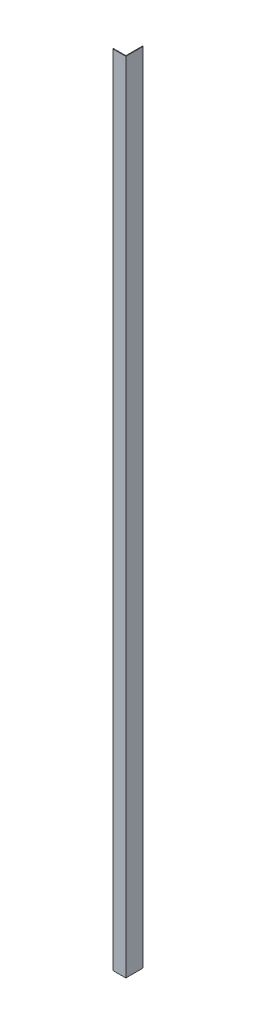
ISO-10303-21;
HEADER;
FILE_DESCRIPTION(('STEP AP214'),'2;1');
FILE_NAME('part.step','',(''),(''),'','','');
FILE_SCHEMA(('AUTOMOTIVE_DESIGN { 1 0 10303 214 1 1 1 1 }'));
ENDSEC;
DATA;
#1=APPLICATION_CONTEXT('core data for automotive mechanical design processes');
#2=APPLICATION_PROTOCOL_DEFINITION('international standard','automotive_design',2000,#1);
#3=PRODUCT_CONTEXT('',#1,'mechanical');
#4=PRODUCT('Part','Part','',(#3));
#5=PRODUCT_RELATED_PRODUCT_CATEGORY('part','',(#4));
#6=PRODUCT_DEFINITION_FORMATION('','',#4);
#7=PRODUCT_DEFINITION_CONTEXT('part definition',#1,'design');
#8=PRODUCT_DEFINITION('design','',#6,#7);
#9=PRODUCT_DEFINITION_SHAPE('','',#8);
#10=(LENGTH_UNIT() NAMED_UNIT(*) SI_UNIT(.MILLI.,.METRE.));
#11=(NAMED_UNIT(*) PLANE_ANGLE_UNIT() SI_UNIT($,.RADIAN.));
#12=(NAMED_UNIT(*) SI_UNIT($,.STERADIAN.) SOLID_ANGLE_UNIT());
#13=UNCERTAINTY_MEASURE_WITH_UNIT(LENGTH_MEASURE(1.E-05),#10,'distance_accuracy_value','');
#14=(GEOMETRIC_REPRESENTATION_CONTEXT(3) GLOBAL_UNCERTAINTY_ASSIGNED_CONTEXT((#13)) GLOBAL_UNIT_ASSIGNED_CONTEXT((#10,
#11,#12)) REPRESENTATION_CONTEXT('',''));
#15=CARTESIAN_POINT('',(0.,0.,0.));
#16=DIRECTION('',(0.,0.,1.));
#17=DIRECTION('',(1.,0.,0.));
#18=AXIS2_PLACEMENT_3D('',#15,#16,#17);
#19=CARTESIAN_POINT('',(30.,1970.,40.));
#20=DIRECTION('',(0.,0.,-1.));
#21=DIRECTION('',(-1.,0.,0.));
#22=AXIS2_PLACEMENT_3D('',#19,#20,#21);
#23=PLANE('',#22);
#24=DIRECTION('',(1.,0.,0.));
#25=VECTOR('',#24,1.);
#26=CARTESIAN_POINT('',(30.,120.,40.));
#27=LINE('',#26,#25);
#28=CARTESIAN_POINT('',(0.,120.,40.));
#29=VERTEX_POINT('',#28);
#30=CARTESIAN_POINT('',(30.,120.,40.));
#31=VERTEX_POINT('',#30);
#32=EDGE_CURVE('E123',#29,#31,#27,.T.);
#33=ORIENTED_EDGE('',*,*,#32,.T.);
#34=DIRECTION('',(0.,-1.,0.));
#35=VECTOR('',#34,1.);
#36=CARTESIAN_POINT('',(30.,1970.,40.));
#37=LINE('',#36,#35);
#38=CARTESIAN_POINT('',(30.,1970.,40.));
#39=VERTEX_POINT('',#38);
#40=EDGE_CURVE('E11',#39,#31,#37,.T.);
#41=ORIENTED_EDGE('',*,*,#40,.F.);
#42=DIRECTION('',(1.,0.,0.));
#43=VECTOR('',#42,1.);
#44=CARTESIAN_POINT('',(30.,1970.,40.));
#45=LINE('',#44,#43);
#46=CARTESIAN_POINT('',(0.,1970.,40.));
#47=VERTEX_POINT('',#46);
#48=EDGE_CURVE('E133',#47,#39,#45,.T.);
#49=ORIENTED_EDGE('',*,*,#48,.F.);
#50=DIRECTION('',(0.,-1.,0.));
#51=VECTOR('',#50,1.);
#52=CARTESIAN_POINT('',(0.,1970.,40.));
#53=LINE('',#52,#51);
#54=EDGE_CURVE('E119',#47,#29,#53,.T.);
#55=ORIENTED_EDGE('',*,*,#54,.T.);
#56=EDGE_LOOP('',(#33,#41,#49,#55));
#57=FACE_BOUND('',#56,.T.);
#58=ADVANCED_FACE('F39',(#57),#23,.F.);
#59=CARTESIAN_POINT('',(30.,1970.,0.));
#60=DIRECTION('',(-1.,0.,0.));
#61=DIRECTION('',(0.,0.,1.));
#62=AXIS2_PLACEMENT_3D('',#59,#60,#61);
#63=PLANE('',#62);
#64=DIRECTION('',(0.,0.,-1.));
#65=VECTOR('',#64,1.);
#66=CARTESIAN_POINT('',(30.,120.,0.));
#67=LINE('',#66,#65);
#68=CARTESIAN_POINT('',(30.,120.,0.));
#69=VERTEX_POINT('',#68);
#70=EDGE_CURVE('E126',#31,#69,#67,.T.);
#71=ORIENTED_EDGE('',*,*,#70,.T.);
#72=DIRECTION('',(0.,-1.,0.));
#73=VECTOR('',#72,1.);
#74=CARTESIAN_POINT('',(30.,1970.,0.));
#75=LINE('',#74,#73);
#76=CARTESIAN_POINT('',(30.,1970.,0.));
#77=VERTEX_POINT('',#76);
#78=EDGE_CURVE('E47',#77,#69,#75,.T.);
#79=ORIENTED_EDGE('',*,*,#78,.F.);
#80=DIRECTION('',(0.,0.,-1.));
#81=VECTOR('',#80,1.);
#82=CARTESIAN_POINT('',(30.,1970.,0.));
#83=LINE('',#82,#81);
#84=EDGE_CURVE('E92',#39,#77,#83,.T.);
#85=ORIENTED_EDGE('',*,*,#84,.F.);
#86=ORIENTED_EDGE('',*,*,#40,.T.);
#87=EDGE_LOOP('',(#71,#79,#85,#86));
#88=FACE_BOUND('',#87,.T.);
#89=ADVANCED_FACE('F157',(#88),#63,.F.);
#90=CARTESIAN_POINT('',(28.5,1970.,0.));
#91=DIRECTION('',(0.,0.,1.));
#92=DIRECTION('',(1.,0.,0.));
#93=AXIS2_PLACEMENT_3D('',#90,#91,#92);
#94=PLANE('',#93);
#95=DIRECTION('',(-1.,0.,0.));
#96=VECTOR('',#95,1.);
#97=CARTESIAN_POINT('',(28.5,120.,0.));
#98=LINE('',#97,#96);
#99=CARTESIAN_POINT('',(28.5,120.,0.));
#100=VERTEX_POINT('',#99);
#101=EDGE_CURVE('E128',#69,#100,#98,.T.);
#102=ORIENTED_EDGE('',*,*,#101,.T.);
#103=DIRECTION('',(0.,-1.,0.));
#104=VECTOR('',#103,1.);
#105=CARTESIAN_POINT('',(28.5,1970.,0.));
#106=LINE('',#105,#104);
#107=CARTESIAN_POINT('',(28.5,1970.,0.));
#108=VERTEX_POINT('',#107);
#109=EDGE_CURVE('E114',#108,#100,#106,.T.);
#110=ORIENTED_EDGE('',*,*,#109,.F.);
#111=DIRECTION('',(-1.,0.,0.));
#112=VECTOR('',#111,1.);
#113=CARTESIAN_POINT('',(28.5,1970.,0.));
#114=LINE('',#113,#112);
#115=EDGE_CURVE('E105',#77,#108,#114,.T.);
#116=ORIENTED_EDGE('',*,*,#115,.F.);
#117=ORIENTED_EDGE('',*,*,#78,.T.);
#118=EDGE_LOOP('',(#102,#110,#116,#117));
#119=FACE_BOUND('',#118,.T.);
#120=ADVANCED_FACE('F139',(#119),#94,.F.);
#121=CARTESIAN_POINT('',(28.5,1970.,38.5));
#122=DIRECTION('',(1.,0.,0.));
#123=DIRECTION('',(0.,0.,-1.));
#124=AXIS2_PLACEMENT_3D('',#121,#122,#123);
#125=PLANE('',#124);
#126=DIRECTION('',(0.,0.,1.));
#127=VECTOR('',#126,1.);
#128=CARTESIAN_POINT('',(28.5,120.,38.5));
#129=LINE('',#128,#127);
#130=CARTESIAN_POINT('',(28.5,120.,38.5));
#131=VERTEX_POINT('',#130);
#132=EDGE_CURVE('E113',#100,#131,#129,.T.);
#133=ORIENTED_EDGE('',*,*,#132,.T.);
#134=DIRECTION('',(0.,-1.,0.));
#135=VECTOR('',#134,1.);
#136=CARTESIAN_POINT('',(28.5,1970.,38.5));
#137=LINE('',#136,#135);
#138=CARTESIAN_POINT('',(28.5,1970.,38.5));
#139=VERTEX_POINT('',#138);
#140=EDGE_CURVE('E110',#139,#131,#137,.T.);
#141=ORIENTED_EDGE('',*,*,#140,.F.);
#142=DIRECTION('',(0.,0.,1.));
#143=VECTOR('',#142,1.);
#144=CARTESIAN_POINT('',(28.5,1970.,38.5));
#145=LINE('',#144,#143);
#146=EDGE_CURVE('E99',#108,#139,#145,.T.);
#147=ORIENTED_EDGE('',*,*,#146,.F.);
#148=ORIENTED_EDGE('',*,*,#109,.T.);
#149=EDGE_LOOP('',(#133,#141,#147,#148));
#150=FACE_BOUND('',#149,.T.);
#151=ADVANCED_FACE('F111',(#150),#125,.F.);
#152=CARTESIAN_POINT('',(0.,1970.,38.5));
#153=DIRECTION('',(0.,0.,1.));
#154=DIRECTION('',(1.,0.,0.));
#155=AXIS2_PLACEMENT_3D('',#152,#153,#154);
#156=PLANE('',#155);
#157=DIRECTION('',(-1.,0.,0.));
#158=VECTOR('',#157,1.);
#159=CARTESIAN_POINT('',(0.,120.,38.5));
#160=LINE('',#159,#158);
#161=CARTESIAN_POINT('',(0.,120.,38.5));
#162=VERTEX_POINT('',#161);
#163=EDGE_CURVE('E78',#131,#162,#160,.T.);
#164=ORIENTED_EDGE('',*,*,#163,.T.);
#165=DIRECTION('',(0.,-1.,0.));
#166=VECTOR('',#165,1.);
#167=CARTESIAN_POINT('',(0.,1970.,38.5));
#168=LINE('',#167,#166);
#169=CARTESIAN_POINT('',(0.,1970.,38.5));
#170=VERTEX_POINT('',#169);
#171=EDGE_CURVE('E115',#170,#162,#168,.T.);
#172=ORIENTED_EDGE('',*,*,#171,.F.);
#173=DIRECTION('',(-1.,0.,0.));
#174=VECTOR('',#173,1.);
#175=CARTESIAN_POINT('',(0.,1970.,38.5));
#176=LINE('',#175,#174);
#177=EDGE_CURVE('E103',#139,#170,#176,.T.);
#178=ORIENTED_EDGE('',*,*,#177,.F.);
#179=ORIENTED_EDGE('',*,*,#140,.T.);
#180=EDGE_LOOP('',(#164,#172,#178,#179));
#181=FACE_BOUND('',#180,.T.);
#182=ADVANCED_FACE('F117',(#181),#156,.F.);
#183=CARTESIAN_POINT('',(0.,1970.,40.));
#184=DIRECTION('',(1.,0.,0.));
#185=DIRECTION('',(0.,0.,-1.));
#186=AXIS2_PLACEMENT_3D('',#183,#184,#185);
#187=PLANE('',#186);
#188=DIRECTION('',(0.,0.,1.));
#189=VECTOR('',#188,1.);
#190=CARTESIAN_POINT('',(0.,120.,40.));
#191=LINE('',#190,#189);
#192=EDGE_CURVE('E84',#162,#29,#191,.T.);
#193=ORIENTED_EDGE('',*,*,#192,.T.);
#194=ORIENTED_EDGE('',*,*,#54,.F.);
#195=DIRECTION('',(0.,0.,1.));
#196=VECTOR('',#195,1.);
#197=CARTESIAN_POINT('',(0.,1970.,40.));
#198=LINE('',#197,#196);
#199=EDGE_CURVE('E55',#170,#47,#198,.T.);
#200=ORIENTED_EDGE('',*,*,#199,.F.);
#201=ORIENTED_EDGE('',*,*,#171,.T.);
#202=EDGE_LOOP('',(#193,#194,#200,#201));
#203=FACE_BOUND('',#202,.T.);
#204=ADVANCED_FACE('F146',(#203),#187,.F.);
#205=CARTESIAN_POINT('',(0.,1970.,0.));
#206=DIRECTION('',(0.,-1.,0.));
#207=DIRECTION('',(0.,0.,-1.));
#208=AXIS2_PLACEMENT_3D('',#205,#206,#207);
#209=PLANE('',#208);
#210=ORIENTED_EDGE('',*,*,#48,.T.);
#211=ORIENTED_EDGE('',*,*,#84,.T.);
#212=ORIENTED_EDGE('',*,*,#115,.T.);
#213=ORIENTED_EDGE('',*,*,#146,.T.);
#214=ORIENTED_EDGE('',*,*,#177,.T.);
#215=ORIENTED_EDGE('',*,*,#199,.T.);
#216=EDGE_LOOP('',(#210,#211,#212,#213,#214,#215));
#217=FACE_BOUND('',#216,.T.);
#218=ADVANCED_FACE('F101',(#217),#209,.F.);
#219=CARTESIAN_POINT('',(0.,120.,0.));
#220=DIRECTION('',(0.,-1.,0.));
#221=DIRECTION('',(0.,0.,-1.));
#222=AXIS2_PLACEMENT_3D('',#219,#220,#221);
#223=PLANE('',#222);
#224=ORIENTED_EDGE('',*,*,#32,.F.);
#225=ORIENTED_EDGE('',*,*,#192,.F.);
#226=ORIENTED_EDGE('',*,*,#163,.F.);
#227=ORIENTED_EDGE('',*,*,#132,.F.);
#228=ORIENTED_EDGE('',*,*,#101,.F.);
#229=ORIENTED_EDGE('',*,*,#70,.F.);
#230=EDGE_LOOP('',(#224,#225,#226,#227,#228,#229));
#231=FACE_BOUND('',#230,.T.);
#232=ADVANCED_FACE('F142',(#231),#223,.T.);
#233=CLOSED_SHELL('',(#58,#89,#120,#151,#182,#204,#218,#232));
#234=MANIFOLD_SOLID_BREP('B2',#233);
#235=ADVANCED_BREP_SHAPE_REPRESENTATION('',(#18,#234),#14);
#236=SHAPE_DEFINITION_REPRESENTATION(#9,#235);
ENDSEC;
END-ISO-10303-21;
